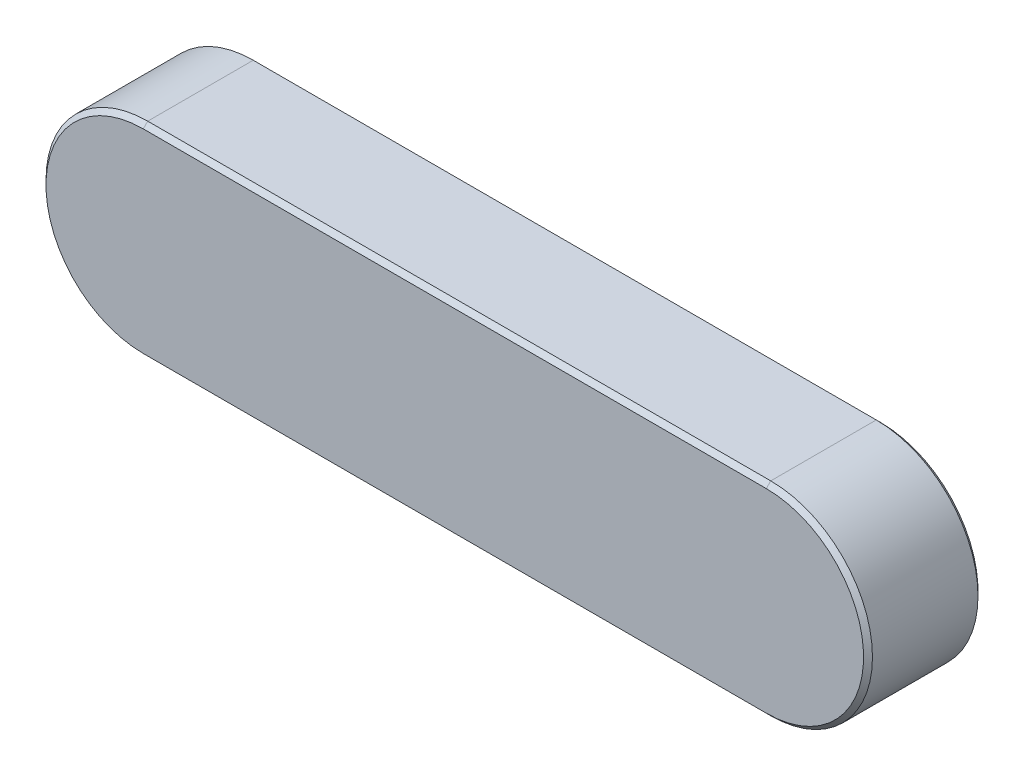
ISO-10303-21;
HEADER;
FILE_DESCRIPTION(('STEP AP214'),'2;1');
FILE_NAME('part.step','',(''),(''),'','','');
FILE_SCHEMA(('AUTOMOTIVE_DESIGN { 1 0 10303 214 1 1 1 1 }'));
ENDSEC;
DATA;
#1=APPLICATION_CONTEXT('core data for automotive mechanical design processes');
#2=APPLICATION_PROTOCOL_DEFINITION('international standard','automotive_design',2000,#1);
#3=PRODUCT_CONTEXT('',#1,'mechanical');
#4=PRODUCT('Part','Part','',(#3));
#5=PRODUCT_RELATED_PRODUCT_CATEGORY('part','',(#4));
#6=PRODUCT_DEFINITION_FORMATION('','',#4);
#7=PRODUCT_DEFINITION_CONTEXT('part definition',#1,'design');
#8=PRODUCT_DEFINITION('design','',#6,#7);
#9=PRODUCT_DEFINITION_SHAPE('','',#8);
#10=(LENGTH_UNIT() NAMED_UNIT(*) SI_UNIT(.MILLI.,.METRE.));
#11=(NAMED_UNIT(*) PLANE_ANGLE_UNIT() SI_UNIT($,.RADIAN.));
#12=(NAMED_UNIT(*) SI_UNIT($,.STERADIAN.) SOLID_ANGLE_UNIT());
#13=UNCERTAINTY_MEASURE_WITH_UNIT(LENGTH_MEASURE(1.E-05),#10,'distance_accuracy_value','');
#14=(GEOMETRIC_REPRESENTATION_CONTEXT(3) GLOBAL_UNCERTAINTY_ASSIGNED_CONTEXT((#13)) GLOBAL_UNIT_ASSIGNED_CONTEXT((#10,
#11,#12)) REPRESENTATION_CONTEXT('',''));
#15=CARTESIAN_POINT('',(0.,0.,0.));
#16=DIRECTION('',(0.,0.,1.));
#17=DIRECTION('',(1.,0.,0.));
#18=AXIS2_PLACEMENT_3D('',#15,#16,#17);
#19=CARTESIAN_POINT('',(0.,0.,18.));
#20=DIRECTION('',(0.,0.,-1.));
#21=DIRECTION('',(-1.,0.,0.));
#22=AXIS2_PLACEMENT_3D('',#19,#20,#21);
#23=CYLINDRICAL_SURFACE('',#22,16.);
#24=DIRECTION('',(0.,0.,-1.));
#25=VECTOR('',#24,1.);
#26=CARTESIAN_POINT('',(0.,16.,18.));
#27=LINE('',#26,#25);
#28=CARTESIAN_POINT('',(0.,16.,17.3));
#29=VERTEX_POINT('',#28);
#30=CARTESIAN_POINT('',(0.,16.,0.699999999999992));
#31=VERTEX_POINT('',#30);
#32=EDGE_CURVE('E106',#29,#31,#27,.T.);
#33=ORIENTED_EDGE('',*,*,#32,.T.);
#34=CARTESIAN_POINT('',(0.,0.,0.699999999999992));
#35=DIRECTION('',(0.,0.,1.));
#36=DIRECTION('',(1.,0.,0.));
#37=AXIS2_PLACEMENT_3D('',#34,#35,#36);
#38=CIRCLE('',#37,16.);
#39=CARTESIAN_POINT('',(0.,-16.,0.699999999999992));
#40=VERTEX_POINT('',#39);
#41=EDGE_CURVE('E159',#31,#40,#38,.T.);
#42=ORIENTED_EDGE('',*,*,#41,.T.);
#43=DIRECTION('',(0.,0.,-1.));
#44=VECTOR('',#43,1.);
#45=CARTESIAN_POINT('',(0.,-16.,18.));
#46=LINE('',#45,#44);
#47=CARTESIAN_POINT('',(0.,-16.,17.3));
#48=VERTEX_POINT('',#47);
#49=EDGE_CURVE('E132',#48,#40,#46,.T.);
#50=ORIENTED_EDGE('',*,*,#49,.F.);
#51=CARTESIAN_POINT('',(0.,0.,17.3));
#52=DIRECTION('',(0.,0.,1.));
#53=DIRECTION('',(1.,0.,0.));
#54=AXIS2_PLACEMENT_3D('',#51,#52,#53);
#55=CIRCLE('',#54,16.);
#56=EDGE_CURVE('E161',#48,#29,#55,.F.);
#57=ORIENTED_EDGE('',*,*,#56,.T.);
#58=EDGE_LOOP('',(#33,#42,#50,#57));
#59=FACE_BOUND('',#58,.T.);
#60=ADVANCED_FACE('F33',(#59),#23,.T.);
#61=CARTESIAN_POINT('',(0.,-16.,18.));
#62=DIRECTION('',(0.,1.,0.));
#63=DIRECTION('',(0.,0.,1.));
#64=AXIS2_PLACEMENT_3D('',#61,#62,#63);
#65=PLANE('',#64);
#66=ORIENTED_EDGE('',*,*,#49,.T.);
#67=DIRECTION('',(1.,0.,0.));
#68=VECTOR('',#67,1.);
#69=CARTESIAN_POINT('',(0.,-16.,0.699999999999992));
#70=LINE('',#69,#68);
#71=CARTESIAN_POINT('',(98.,-16.,0.699999999999992));
#72=VERTEX_POINT('',#71);
#73=EDGE_CURVE('E155',#40,#72,#70,.T.);
#74=ORIENTED_EDGE('',*,*,#73,.T.);
#75=DIRECTION('',(0.,0.,-1.));
#76=VECTOR('',#75,1.);
#77=CARTESIAN_POINT('',(98.,-16.,18.));
#78=LINE('',#77,#76);
#79=CARTESIAN_POINT('',(98.,-16.,17.3));
#80=VERTEX_POINT('',#79);
#81=EDGE_CURVE('E123',#80,#72,#78,.T.);
#82=ORIENTED_EDGE('',*,*,#81,.F.);
#83=DIRECTION('',(-1.,0.,0.));
#84=VECTOR('',#83,1.);
#85=CARTESIAN_POINT('',(0.,-16.,17.3));
#86=LINE('',#85,#84);
#87=EDGE_CURVE('E157',#80,#48,#86,.T.);
#88=ORIENTED_EDGE('',*,*,#87,.T.);
#89=EDGE_LOOP('',(#66,#74,#82,#88));
#90=FACE_BOUND('',#89,.T.);
#91=ADVANCED_FACE('F200',(#90),#65,.F.);
#92=CARTESIAN_POINT('',(98.,0.,18.));
#93=DIRECTION('',(0.,0.,-1.));
#94=DIRECTION('',(-1.,0.,0.));
#95=AXIS2_PLACEMENT_3D('',#92,#93,#94);
#96=CYLINDRICAL_SURFACE('',#95,16.);
#97=ORIENTED_EDGE('',*,*,#81,.T.);
#98=CARTESIAN_POINT('',(98.,0.,0.699999999999992));
#99=DIRECTION('',(0.,0.,1.));
#100=DIRECTION('',(1.,0.,0.));
#101=AXIS2_PLACEMENT_3D('',#98,#99,#100);
#102=CIRCLE('',#101,16.);
#103=CARTESIAN_POINT('',(98.,16.,0.699999999999992));
#104=VERTEX_POINT('',#103);
#105=EDGE_CURVE('E122',#72,#104,#102,.T.);
#106=ORIENTED_EDGE('',*,*,#105,.T.);
#107=DIRECTION('',(0.,0.,-1.));
#108=VECTOR('',#107,1.);
#109=CARTESIAN_POINT('',(98.,16.,18.));
#110=LINE('',#109,#108);
#111=CARTESIAN_POINT('',(98.,16.,17.3));
#112=VERTEX_POINT('',#111);
#113=EDGE_CURVE('E104',#112,#104,#110,.T.);
#114=ORIENTED_EDGE('',*,*,#113,.F.);
#115=CARTESIAN_POINT('',(98.,0.,17.3));
#116=DIRECTION('',(0.,0.,1.));
#117=DIRECTION('',(1.,0.,0.));
#118=AXIS2_PLACEMENT_3D('',#115,#116,#117);
#119=CIRCLE('',#118,16.);
#120=EDGE_CURVE('E119',#112,#80,#119,.F.);
#121=ORIENTED_EDGE('',*,*,#120,.T.);
#122=EDGE_LOOP('',(#97,#106,#114,#121));
#123=FACE_BOUND('',#122,.T.);
#124=ADVANCED_FACE('F118',(#123),#96,.T.);
#125=CARTESIAN_POINT('',(0.,16.,18.));
#126=DIRECTION('',(0.,-1.,0.));
#127=DIRECTION('',(0.,0.,-1.));
#128=AXIS2_PLACEMENT_3D('',#125,#126,#127);
#129=PLANE('',#128);
#130=ORIENTED_EDGE('',*,*,#113,.T.);
#131=DIRECTION('',(-1.,0.,0.));
#132=VECTOR('',#131,1.);
#133=CARTESIAN_POINT('',(0.,16.,0.699999999999992));
#134=LINE('',#133,#132);
#135=EDGE_CURVE('E111',#104,#31,#134,.T.);
#136=ORIENTED_EDGE('',*,*,#135,.T.);
#137=ORIENTED_EDGE('',*,*,#32,.F.);
#138=DIRECTION('',(1.,0.,0.));
#139=VECTOR('',#138,1.);
#140=CARTESIAN_POINT('',(98.,16.,17.3));
#141=LINE('',#140,#139);
#142=EDGE_CURVE('E101',#29,#112,#141,.T.);
#143=ORIENTED_EDGE('',*,*,#142,.T.);
#144=EDGE_LOOP('',(#130,#136,#137,#143));
#145=FACE_BOUND('',#144,.T.);
#146=ADVANCED_FACE('F103',(#145),#129,.F.);
#147=CARTESIAN_POINT('',(0.,0.,18.));
#148=DIRECTION('',(0.,0.,1.));
#149=DIRECTION('',(1.,0.,0.));
#150=AXIS2_PLACEMENT_3D('',#147,#148,#149);
#151=PLANE('',#150);
#152=DIRECTION('',(-1.,0.,0.));
#153=VECTOR('',#152,1.);
#154=CARTESIAN_POINT('',(0.,15.3,18.));
#155=LINE('',#154,#153);
#156=CARTESIAN_POINT('',(98.,15.3,18.));
#157=VERTEX_POINT('',#156);
#158=CARTESIAN_POINT('',(0.,15.3,18.));
#159=VERTEX_POINT('',#158);
#160=EDGE_CURVE('E135',#157,#159,#155,.T.);
#161=ORIENTED_EDGE('',*,*,#160,.T.);
#162=CARTESIAN_POINT('',(0.,0.,18.));
#163=DIRECTION('',(0.,0.,1.));
#164=DIRECTION('',(1.,0.,0.));
#165=AXIS2_PLACEMENT_3D('',#162,#163,#164);
#166=CIRCLE('',#165,15.3);
#167=CARTESIAN_POINT('',(0.,-15.3,18.));
#168=VERTEX_POINT('',#167);
#169=EDGE_CURVE('E11',#159,#168,#166,.T.);
#170=ORIENTED_EDGE('',*,*,#169,.T.);
#171=DIRECTION('',(1.,0.,0.));
#172=VECTOR('',#171,1.);
#173=CARTESIAN_POINT('',(98.,-15.3,18.));
#174=LINE('',#173,#172);
#175=CARTESIAN_POINT('',(98.,-15.3,18.));
#176=VERTEX_POINT('',#175);
#177=EDGE_CURVE('E42',#168,#176,#174,.T.);
#178=ORIENTED_EDGE('',*,*,#177,.T.);
#179=CARTESIAN_POINT('',(98.,0.,18.));
#180=DIRECTION('',(0.,0.,1.));
#181=DIRECTION('',(1.,0.,0.));
#182=AXIS2_PLACEMENT_3D('',#179,#180,#181);
#183=CIRCLE('',#182,15.3);
#184=EDGE_CURVE('E152',#176,#157,#183,.T.);
#185=ORIENTED_EDGE('',*,*,#184,.T.);
#186=EDGE_LOOP('',(#161,#170,#178,#185));
#187=FACE_BOUND('',#186,.T.);
#188=ADVANCED_FACE('F203',(#187),#151,.T.);
#189=CARTESIAN_POINT('',(0.,0.,0.));
#190=DIRECTION('',(0.,0.,1.));
#191=DIRECTION('',(1.,0.,0.));
#192=AXIS2_PLACEMENT_3D('',#189,#190,#191);
#193=PLANE('',#192);
#194=DIRECTION('',(1.,0.,0.));
#195=VECTOR('',#194,1.);
#196=CARTESIAN_POINT('',(0.,15.3,0.));
#197=LINE('',#196,#195);
#198=CARTESIAN_POINT('',(0.,15.3,0.));
#199=VERTEX_POINT('',#198);
#200=CARTESIAN_POINT('',(98.,15.3,0.));
#201=VERTEX_POINT('',#200);
#202=EDGE_CURVE('E166',#199,#201,#197,.T.);
#203=ORIENTED_EDGE('',*,*,#202,.T.);
#204=CARTESIAN_POINT('',(98.,0.,0.));
#205=DIRECTION('',(0.,0.,1.));
#206=DIRECTION('',(1.,0.,0.));
#207=AXIS2_PLACEMENT_3D('',#204,#205,#206);
#208=CIRCLE('',#207,15.3);
#209=CARTESIAN_POINT('',(98.,-15.3,0.));
#210=VERTEX_POINT('',#209);
#211=EDGE_CURVE('E112',#201,#210,#208,.F.);
#212=ORIENTED_EDGE('',*,*,#211,.T.);
#213=DIRECTION('',(-1.,0.,0.));
#214=VECTOR('',#213,1.);
#215=CARTESIAN_POINT('',(0.,-15.3,0.));
#216=LINE('',#215,#214);
#217=CARTESIAN_POINT('',(0.,-15.3,0.));
#218=VERTEX_POINT('',#217);
#219=EDGE_CURVE('E170',#210,#218,#216,.T.);
#220=ORIENTED_EDGE('',*,*,#219,.T.);
#221=CARTESIAN_POINT('',(0.,0.,0.));
#222=DIRECTION('',(0.,0.,1.));
#223=DIRECTION('',(1.,0.,0.));
#224=AXIS2_PLACEMENT_3D('',#221,#222,#223);
#225=CIRCLE('',#224,15.3);
#226=EDGE_CURVE('E168',#218,#199,#225,.F.);
#227=ORIENTED_EDGE('',*,*,#226,.T.);
#228=EDGE_LOOP('',(#203,#212,#220,#227));
#229=FACE_BOUND('',#228,.T.);
#230=ADVANCED_FACE('F192',(#229),#193,.F.);
#231=CARTESIAN_POINT('',(0.,0.,0.699999999999992));
#232=DIRECTION('',(0.,0.,1.));
#233=DIRECTION('',(1.,0.,0.));
#234=AXIS2_PLACEMENT_3D('',#231,#232,#233);
#235=CONICAL_SURFACE('',#234,16.,0.785398163397458);
#236=DIRECTION('',(0.,0.707106781186554,0.70710678118654));
#237=VECTOR('',#236,1.);
#238=CARTESIAN_POINT('',(0.,15.3,0.));
#239=LINE('',#238,#237);
#240=EDGE_CURVE('E147',#199,#31,#239,.T.);
#241=ORIENTED_EDGE('',*,*,#240,.F.);
#242=ORIENTED_EDGE('',*,*,#226,.F.);
#243=DIRECTION('',(0.,0.707106781186554,-0.70710678118654));
#244=VECTOR('',#243,1.);
#245=CARTESIAN_POINT('',(0.,-16.,0.699999999999992));
#246=LINE('',#245,#244);
#247=EDGE_CURVE('E144',#40,#218,#246,.T.);
#248=ORIENTED_EDGE('',*,*,#247,.F.);
#249=ORIENTED_EDGE('',*,*,#41,.F.);
#250=EDGE_LOOP('',(#241,#242,#248,#249));
#251=FACE_BOUND('',#250,.T.);
#252=ADVANCED_FACE('F182',(#251),#235,.T.);
#253=CARTESIAN_POINT('',(0.,-16.,0.699999999999992));
#254=DIRECTION('',(0.,0.70710678118654,0.707106781186554));
#255=DIRECTION('',(1.,0.,0.));
#256=AXIS2_PLACEMENT_3D('',#253,#254,#255);
#257=PLANE('',#256);
#258=ORIENTED_EDGE('',*,*,#247,.T.);
#259=ORIENTED_EDGE('',*,*,#219,.F.);
#260=DIRECTION('',(0.,0.707106781186554,-0.70710678118654));
#261=VECTOR('',#260,1.);
#262=CARTESIAN_POINT('',(98.,-16.,0.699999999999992));
#263=LINE('',#262,#261);
#264=EDGE_CURVE('E137',#72,#210,#263,.T.);
#265=ORIENTED_EDGE('',*,*,#264,.F.);
#266=ORIENTED_EDGE('',*,*,#73,.F.);
#267=EDGE_LOOP('',(#258,#259,#265,#266));
#268=FACE_BOUND('',#267,.T.);
#269=ADVANCED_FACE('F198',(#268),#257,.F.);
#270=CARTESIAN_POINT('',(0.,16.,0.699999999999992));
#271=DIRECTION('',(0.,-0.70710678118654,0.707106781186554));
#272=DIRECTION('',(-1.,0.,0.));
#273=AXIS2_PLACEMENT_3D('',#270,#271,#272);
#274=PLANE('',#273);
#275=ORIENTED_EDGE('',*,*,#240,.T.);
#276=ORIENTED_EDGE('',*,*,#135,.F.);
#277=DIRECTION('',(0.,0.707106781186554,0.70710678118654));
#278=VECTOR('',#277,1.);
#279=CARTESIAN_POINT('',(98.,15.3,0.));
#280=LINE('',#279,#278);
#281=EDGE_CURVE('E136',#201,#104,#280,.T.);
#282=ORIENTED_EDGE('',*,*,#281,.F.);
#283=ORIENTED_EDGE('',*,*,#202,.F.);
#284=EDGE_LOOP('',(#275,#276,#282,#283));
#285=FACE_BOUND('',#284,.T.);
#286=ADVANCED_FACE('F188',(#285),#274,.F.);
#287=CARTESIAN_POINT('',(98.,0.,0.699999999999992));
#288=DIRECTION('',(0.,0.,1.));
#289=DIRECTION('',(1.,0.,0.));
#290=AXIS2_PLACEMENT_3D('',#287,#288,#289);
#291=CONICAL_SURFACE('',#290,16.,0.785398163397458);
#292=ORIENTED_EDGE('',*,*,#264,.T.);
#293=ORIENTED_EDGE('',*,*,#211,.F.);
#294=ORIENTED_EDGE('',*,*,#281,.T.);
#295=ORIENTED_EDGE('',*,*,#105,.F.);
#296=EDGE_LOOP('',(#292,#293,#294,#295));
#297=FACE_BOUND('',#296,.T.);
#298=ADVANCED_FACE('F194',(#297),#291,.T.);
#299=CARTESIAN_POINT('',(98.,0.,18.));
#300=DIRECTION('',(0.,0.,-1.));
#301=DIRECTION('',(-1.,0.,0.));
#302=AXIS2_PLACEMENT_3D('',#299,#300,#301);
#303=CONICAL_SURFACE('',#302,15.3,0.785398163397448);
#304=DIRECTION('',(0.,0.707106781186548,0.707106781186548));
#305=VECTOR('',#304,1.);
#306=CARTESIAN_POINT('',(98.,-16.,17.3));
#307=LINE('',#306,#305);
#308=EDGE_CURVE('E130',#80,#176,#307,.T.);
#309=ORIENTED_EDGE('',*,*,#308,.F.);
#310=ORIENTED_EDGE('',*,*,#120,.F.);
#311=DIRECTION('',(0.,0.707106781186548,-0.707106781186548));
#312=VECTOR('',#311,1.);
#313=CARTESIAN_POINT('',(98.,15.3,18.));
#314=LINE('',#313,#312);
#315=EDGE_CURVE('E37',#157,#112,#314,.T.);
#316=ORIENTED_EDGE('',*,*,#315,.F.);
#317=ORIENTED_EDGE('',*,*,#184,.F.);
#318=EDGE_LOOP('',(#309,#310,#316,#317));
#319=FACE_BOUND('',#318,.T.);
#320=ADVANCED_FACE('F35',(#319),#303,.T.);
#321=CARTESIAN_POINT('',(0.,15.3,18.));
#322=DIRECTION('',(0.,0.707106781186548,0.707106781186548));
#323=DIRECTION('',(1.,0.,0.));
#324=AXIS2_PLACEMENT_3D('',#321,#322,#323);
#325=PLANE('',#324);
#326=ORIENTED_EDGE('',*,*,#315,.T.);
#327=ORIENTED_EDGE('',*,*,#142,.F.);
#328=DIRECTION('',(0.,0.707106781186548,-0.707106781186548));
#329=VECTOR('',#328,1.);
#330=CARTESIAN_POINT('',(0.,15.3,18.));
#331=LINE('',#330,#329);
#332=EDGE_CURVE('E139',#159,#29,#331,.T.);
#333=ORIENTED_EDGE('',*,*,#332,.F.);
#334=ORIENTED_EDGE('',*,*,#160,.F.);
#335=EDGE_LOOP('',(#326,#327,#333,#334));
#336=FACE_BOUND('',#335,.T.);
#337=ADVANCED_FACE('F134',(#336),#325,.T.);
#338=CARTESIAN_POINT('',(0.,-15.3,18.));
#339=DIRECTION('',(0.,-0.707106781186548,0.707106781186548));
#340=DIRECTION('',(-1.,0.,0.));
#341=AXIS2_PLACEMENT_3D('',#338,#339,#340);
#342=PLANE('',#341);
#343=ORIENTED_EDGE('',*,*,#308,.T.);
#344=ORIENTED_EDGE('',*,*,#177,.F.);
#345=DIRECTION('',(0.,0.707106781186548,0.707106781186548));
#346=VECTOR('',#345,1.);
#347=CARTESIAN_POINT('',(0.,-16.,17.3));
#348=LINE('',#347,#346);
#349=EDGE_CURVE('E50',#48,#168,#348,.T.);
#350=ORIENTED_EDGE('',*,*,#349,.F.);
#351=ORIENTED_EDGE('',*,*,#87,.F.);
#352=EDGE_LOOP('',(#343,#344,#350,#351));
#353=FACE_BOUND('',#352,.T.);
#354=ADVANCED_FACE('F202',(#353),#342,.T.);
#355=CARTESIAN_POINT('',(0.,0.,18.));
#356=DIRECTION('',(0.,0.,-1.));
#357=DIRECTION('',(-1.,0.,0.));
#358=AXIS2_PLACEMENT_3D('',#355,#356,#357);
#359=CONICAL_SURFACE('',#358,15.3,0.785398163397448);
#360=ORIENTED_EDGE('',*,*,#332,.T.);
#361=ORIENTED_EDGE('',*,*,#56,.F.);
#362=ORIENTED_EDGE('',*,*,#349,.T.);
#363=ORIENTED_EDGE('',*,*,#169,.F.);
#364=EDGE_LOOP('',(#360,#361,#362,#363));
#365=FACE_BOUND('',#364,.T.);
#366=ADVANCED_FACE('F201',(#365),#359,.T.);
#367=CLOSED_SHELL('',(#60,#91,#124,#146,#188,#230,#252,#269,#286,#298,#320,#337,#354,#366));
#368=MANIFOLD_SOLID_BREP('B2',#367);
#369=ADVANCED_BREP_SHAPE_REPRESENTATION('',(#18,#368),#14);
#370=SHAPE_DEFINITION_REPRESENTATION(#9,#369);
ENDSEC;
END-ISO-10303-21;
